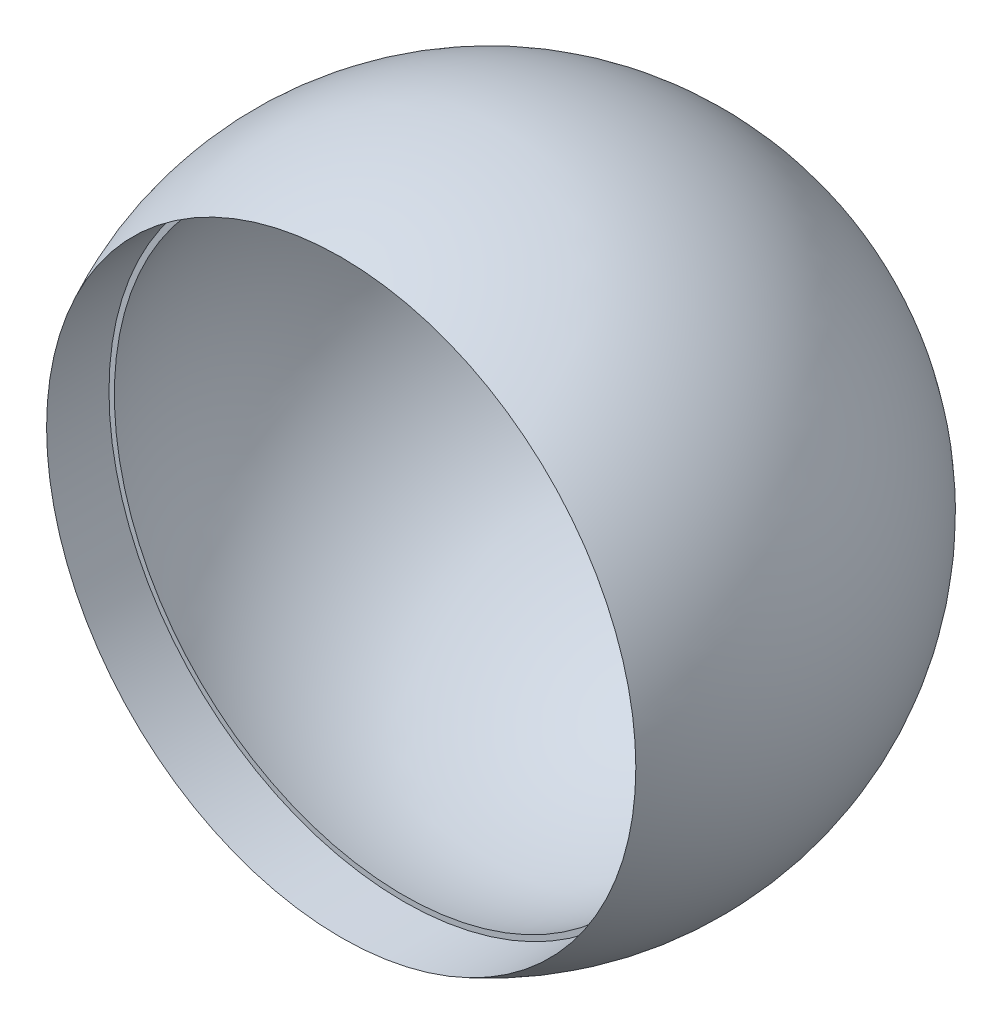
ISO-10303-21;
HEADER;
FILE_DESCRIPTION(('STEP AP214'),'2;1');
FILE_NAME('part.step','',(''),(''),'','','');
FILE_SCHEMA(('AUTOMOTIVE_DESIGN { 1 0 10303 214 1 1 1 1 }'));
ENDSEC;
DATA;
#1=APPLICATION_CONTEXT('core data for automotive mechanical design processes');
#2=APPLICATION_PROTOCOL_DEFINITION('international standard','automotive_design',2000,#1);
#3=PRODUCT_CONTEXT('',#1,'mechanical');
#4=PRODUCT('Part','Part','',(#3));
#5=PRODUCT_RELATED_PRODUCT_CATEGORY('part','',(#4));
#6=PRODUCT_DEFINITION_FORMATION('','',#4);
#7=PRODUCT_DEFINITION_CONTEXT('part definition',#1,'design');
#8=PRODUCT_DEFINITION('design','',#6,#7);
#9=PRODUCT_DEFINITION_SHAPE('','',#8);
#10=(LENGTH_UNIT() NAMED_UNIT(*) SI_UNIT(.MILLI.,.METRE.));
#11=(NAMED_UNIT(*) PLANE_ANGLE_UNIT() SI_UNIT($,.RADIAN.));
#12=(NAMED_UNIT(*) SI_UNIT($,.STERADIAN.) SOLID_ANGLE_UNIT());
#13=UNCERTAINTY_MEASURE_WITH_UNIT(LENGTH_MEASURE(1.E-05),#10,'distance_accuracy_value','');
#14=(GEOMETRIC_REPRESENTATION_CONTEXT(3) GLOBAL_UNCERTAINTY_ASSIGNED_CONTEXT((#13)) GLOBAL_UNIT_ASSIGNED_CONTEXT((#10,
#11,#12)) REPRESENTATION_CONTEXT('',''));
#15=CARTESIAN_POINT('',(0.,0.,0.));
#16=DIRECTION('',(0.,0.,1.));
#17=DIRECTION('',(1.,0.,0.));
#18=AXIS2_PLACEMENT_3D('',#15,#16,#17);
#19=CARTESIAN_POINT('',(0.,0.,0.));
#20=DIRECTION('',(0.,1.,0.));
#21=DIRECTION('',(1.,0.,0.));
#22=AXIS2_PLACEMENT_3D('',#19,#20,#21);
#23=SPHERICAL_SURFACE('',#22,215.);
#24=CARTESIAN_POINT('',(0.,0.,0.));
#25=DIRECTION('',(0.,0.,1.));
#26=DIRECTION('',(1.,0.,0.));
#27=AXIS2_PLACEMENT_3D('',#24,#25,#26);
#28=SPHERICAL_SURFACE('',#27,215.);
#29=CARTESIAN_POINT('',(0.,0.,61.));
#30=DIRECTION('',(0.,0.,1.));
#31=DIRECTION('',(1.,0.,0.));
#32=AXIS2_PLACEMENT_3D('',#29,#30,#31);
#33=CIRCLE('',#32,206.164982477626);
#34=CARTESIAN_POINT('',(206.164982477626,0.,61.));
#35=VERTEX_POINT('',#34);
#36=EDGE_CURVE('E43',#35,#35,#33,.T.);
#37=ORIENTED_EDGE('',*,*,#36,.T.);
#38=EDGE_LOOP('',(#37));
#39=FACE_BOUND('',#38,.T.);
#40=ADVANCED_FACE('F37',(#39),#28,.F.);
#41=CARTESIAN_POINT('',(0.,0.,61.));
#42=DIRECTION('',(0.,0.,1.));
#43=DIRECTION('',(1.,0.,0.));
#44=AXIS2_PLACEMENT_3D('',#41,#42,#43);
#45=CYLINDRICAL_SURFACE('',#44,210.);
#46=CARTESIAN_POINT('',(0.,0.,61.));
#47=DIRECTION('',(0.,0.,1.));
#48=DIRECTION('',(1.,0.,0.));
#49=AXIS2_PLACEMENT_3D('',#46,#47,#48);
#50=CIRCLE('',#49,210.);
#51=CARTESIAN_POINT('',(210.,0.,61.));
#52=VERTEX_POINT('',#51);
#53=EDGE_CURVE('E47',#52,#52,#50,.T.);
#54=ORIENTED_EDGE('',*,*,#53,.F.);
#55=EDGE_LOOP('',(#54));
#56=FACE_BOUND('',#55,.T.);
#57=CARTESIAN_POINT('',(0.,0.,105.475115548645));
#58=DIRECTION('',(0.,0.,-1.));
#59=DIRECTION('',(-1.,0.,0.));
#60=AXIS2_PLACEMENT_3D('',#57,#58,#59);
#61=CIRCLE('',#60,210.);
#62=CARTESIAN_POINT('',(-210.,0.,105.475115548645));
#63=VERTEX_POINT('',#62);
#64=EDGE_CURVE('E10',#63,#63,#61,.T.);
#65=ORIENTED_EDGE('',*,*,#64,.F.);
#66=EDGE_LOOP('',(#65));
#67=FACE_BOUND('',#66,.T.);
#68=ADVANCED_FACE('F56',(#56,#67),#45,.F.);
#69=CARTESIAN_POINT('',(0.,0.,61.));
#70=DIRECTION('',(0.,0.,1.));
#71=DIRECTION('',(1.,0.,0.));
#72=AXIS2_PLACEMENT_3D('',#69,#70,#71);
#73=PLANE('',#72);
#74=ORIENTED_EDGE('',*,*,#36,.F.);
#75=EDGE_LOOP('',(#74));
#76=FACE_BOUND('',#75,.T.);
#77=ORIENTED_EDGE('',*,*,#53,.T.);
#78=EDGE_LOOP('',(#77));
#79=FACE_BOUND('',#78,.T.);
#80=ADVANCED_FACE('F54',(#76,#79),#73,.T.);
#81=CARTESIAN_POINT('',(0.,0.,0.));
#82=DIRECTION('',(0.,1.,0.));
#83=DIRECTION('',(1.,0.,0.));
#84=AXIS2_PLACEMENT_3D('',#81,#82,#83);
#85=SPHERICAL_SURFACE('',#84,235.);
#86=CARTESIAN_POINT('',(0.,0.,0.));
#87=DIRECTION('',(0.,0.,-1.));
#88=DIRECTION('',(-1.,0.,0.));
#89=AXIS2_PLACEMENT_3D('',#86,#87,#88);
#90=SPHERICAL_SURFACE('',#89,235.);
#91=ORIENTED_EDGE('',*,*,#64,.T.);
#92=EDGE_LOOP('',(#91));
#93=FACE_BOUND('',#92,.T.);
#94=ADVANCED_FACE('F64',(#93),#90,.T.);
#95=CLOSED_SHELL('',(#40,#68,#80,#94));
#96=MANIFOLD_SOLID_BREP('B2',#95);
#97=ADVANCED_BREP_SHAPE_REPRESENTATION('',(#18,#96),#14);
#98=SHAPE_DEFINITION_REPRESENTATION(#9,#97);
ENDSEC;
END-ISO-10303-21;
